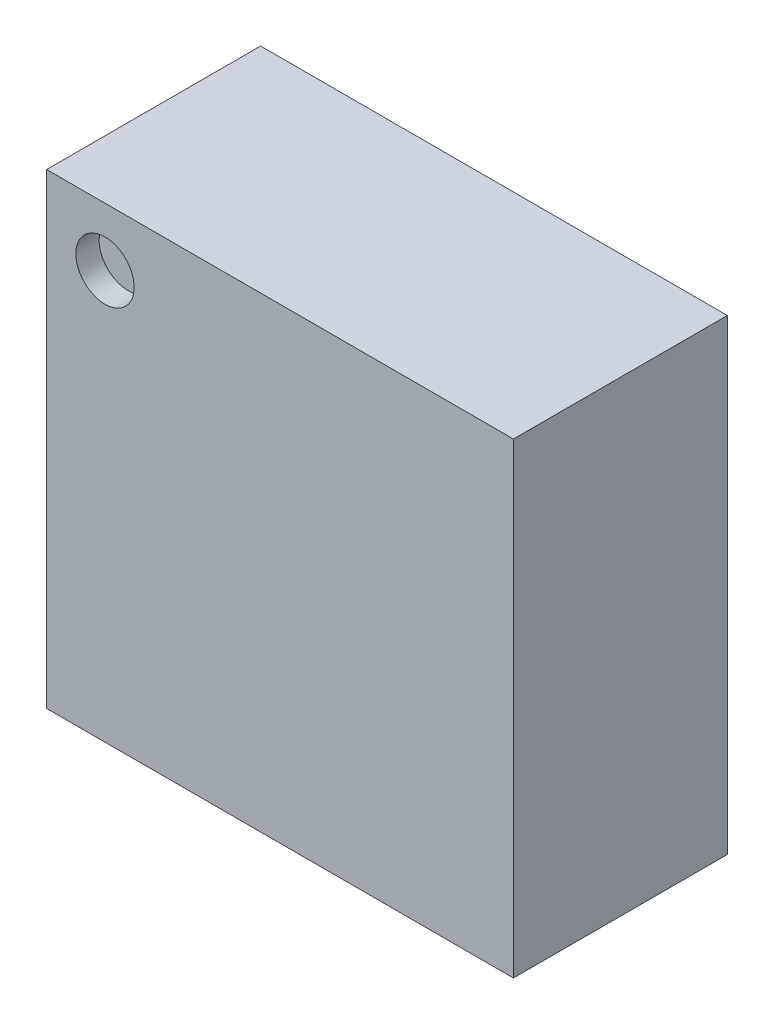
ISO-10303-21;
HEADER;
FILE_DESCRIPTION(('STEP AP214'),'2;1');
FILE_NAME('part.step','',(''),(''),'','','');
FILE_SCHEMA(('AUTOMOTIVE_DESIGN { 1 0 10303 214 1 1 1 1 }'));
ENDSEC;
DATA;
#1=APPLICATION_CONTEXT('core data for automotive mechanical design processes');
#2=APPLICATION_PROTOCOL_DEFINITION('international standard','automotive_design',2000,#1);
#3=PRODUCT_CONTEXT('',#1,'mechanical');
#4=PRODUCT('Part','Part','',(#3));
#5=PRODUCT_RELATED_PRODUCT_CATEGORY('part','',(#4));
#6=PRODUCT_DEFINITION_FORMATION('','',#4);
#7=PRODUCT_DEFINITION_CONTEXT('part definition',#1,'design');
#8=PRODUCT_DEFINITION('design','',#6,#7);
#9=PRODUCT_DEFINITION_SHAPE('','',#8);
#10=(LENGTH_UNIT() NAMED_UNIT(*) SI_UNIT(.MILLI.,.METRE.));
#11=(NAMED_UNIT(*) PLANE_ANGLE_UNIT() SI_UNIT($,.RADIAN.));
#12=(NAMED_UNIT(*) SI_UNIT($,.STERADIAN.) SOLID_ANGLE_UNIT());
#13=UNCERTAINTY_MEASURE_WITH_UNIT(LENGTH_MEASURE(1.E-05),#10,'distance_accuracy_value','');
#14=(GEOMETRIC_REPRESENTATION_CONTEXT(3) GLOBAL_UNCERTAINTY_ASSIGNED_CONTEXT((#13)) GLOBAL_UNIT_ASSIGNED_CONTEXT((#10,
#11,#12)) REPRESENTATION_CONTEXT('',''));
#15=CARTESIAN_POINT('',(0.,0.,0.));
#16=DIRECTION('',(0.,0.,1.));
#17=DIRECTION('',(1.,0.,0.));
#18=AXIS2_PLACEMENT_3D('',#15,#16,#17);
#19=CARTESIAN_POINT('',(-0.45,0.45,0.54));
#20=DIRECTION('',(0.,0.,1.));
#21=DIRECTION('',(1.,0.,0.));
#22=AXIS2_PLACEMENT_3D('',#19,#20,#21);
#23=PLANE('',#22);
#24=CARTESIAN_POINT('',(-0.45,0.45,0.54));
#25=DIRECTION('',(0.,0.,1.));
#26=DIRECTION('',(1.,0.,0.));
#27=AXIS2_PLACEMENT_3D('',#24,#25,#26);
#28=CIRCLE('',#27,0.075);
#29=CARTESIAN_POINT('',(-0.375,0.45,0.54));
#30=VERTEX_POINT('',#29);
#31=EDGE_CURVE('E20',#30,#30,#28,.T.);
#32=ORIENTED_EDGE('',*,*,#31,.T.);
#33=EDGE_LOOP('',(#32));
#34=FACE_BOUND('',#33,.T.);
#35=ADVANCED_FACE('F17',(#34),#23,.T.);
#36=CARTESIAN_POINT('',(-0.45,0.45,0.54));
#37=DIRECTION('',(0.,0.,1.));
#38=DIRECTION('',(1.,0.,0.));
#39=AXIS2_PLACEMENT_3D('',#36,#37,#38);
#40=CYLINDRICAL_SURFACE('',#39,0.075);
#41=CARTESIAN_POINT('',(-0.45,0.45,0.6));
#42=DIRECTION('',(0.,0.,1.));
#43=DIRECTION('',(1.,0.,0.));
#44=AXIS2_PLACEMENT_3D('',#41,#42,#43);
#45=CIRCLE('',#44,0.075);
#46=CARTESIAN_POINT('',(-0.375,0.45,0.6));
#47=VERTEX_POINT('',#46);
#48=EDGE_CURVE('E66',#47,#47,#45,.F.);
#49=ORIENTED_EDGE('',*,*,#48,.F.);
#50=EDGE_LOOP('',(#49));
#51=FACE_BOUND('',#50,.T.);
#52=ORIENTED_EDGE('',*,*,#31,.F.);
#53=EDGE_LOOP('',(#52));
#54=FACE_BOUND('',#53,.T.);
#55=ADVANCED_FACE('F87',(#51,#54),#40,.F.);
#56=CARTESIAN_POINT('',(-0.6,-0.6,0.6));
#57=DIRECTION('',(0.,0.,1.));
#58=DIRECTION('',(1.,0.,0.));
#59=AXIS2_PLACEMENT_3D('',#56,#57,#58);
#60=PLANE('',#59);
#61=ORIENTED_EDGE('',*,*,#48,.T.);
#62=EDGE_LOOP('',(#61));
#63=FACE_BOUND('',#62,.T.);
#64=DIRECTION('',(0.,1.,0.));
#65=VECTOR('',#64,1.);
#66=CARTESIAN_POINT('',(0.6,-0.6,0.6));
#67=LINE('',#66,#65);
#68=CARTESIAN_POINT('',(0.6,0.6,0.6));
#69=VERTEX_POINT('',#68);
#70=CARTESIAN_POINT('',(0.6,-0.6,0.6));
#71=VERTEX_POINT('',#70);
#72=EDGE_CURVE('E166',#69,#71,#67,.F.);
#73=ORIENTED_EDGE('',*,*,#72,.F.);
#74=DIRECTION('',(1.,0.,0.));
#75=VECTOR('',#74,1.);
#76=CARTESIAN_POINT('',(-0.6,0.6,0.6));
#77=LINE('',#76,#75);
#78=CARTESIAN_POINT('',(-0.6,0.6,0.6));
#79=VERTEX_POINT('',#78);
#80=EDGE_CURVE('E60',#79,#69,#77,.T.);
#81=ORIENTED_EDGE('',*,*,#80,.F.);
#82=DIRECTION('',(0.,1.,0.));
#83=VECTOR('',#82,1.);
#84=CARTESIAN_POINT('',(-0.6,-0.6,0.6));
#85=LINE('',#84,#83);
#86=CARTESIAN_POINT('',(-0.6,-0.6,0.6));
#87=VERTEX_POINT('',#86);
#88=EDGE_CURVE('E58',#79,#87,#85,.F.);
#89=ORIENTED_EDGE('',*,*,#88,.T.);
#90=DIRECTION('',(1.,0.,0.));
#91=VECTOR('',#90,1.);
#92=CARTESIAN_POINT('',(-0.6,-0.6,0.6));
#93=LINE('',#92,#91);
#94=EDGE_CURVE('E55',#87,#71,#93,.T.);
#95=ORIENTED_EDGE('',*,*,#94,.T.);
#96=EDGE_LOOP('',(#73,#81,#89,#95));
#97=FACE_BOUND('',#96,.T.);
#98=ADVANCED_FACE('F59',(#63,#97),#60,.T.);
#99=CARTESIAN_POINT('',(-0.6,-0.6,0.05));
#100=DIRECTION('',(1.,0.,0.));
#101=DIRECTION('',(0.,0.,-1.));
#102=AXIS2_PLACEMENT_3D('',#99,#100,#101);
#103=PLANE('',#102);
#104=DIRECTION('',(0.,0.,1.));
#105=VECTOR('',#104,1.);
#106=CARTESIAN_POINT('',(-0.6,0.6,0.05));
#107=LINE('',#106,#105);
#108=CARTESIAN_POINT('',(-0.6,0.6,0.05));
#109=VERTEX_POINT('',#108);
#110=EDGE_CURVE('E170',#109,#79,#107,.T.);
#111=ORIENTED_EDGE('',*,*,#110,.F.);
#112=DIRECTION('',(0.,1.,0.));
#113=VECTOR('',#112,1.);
#114=CARTESIAN_POINT('',(-0.6,-0.6,0.05));
#115=LINE('',#114,#113);
#116=CARTESIAN_POINT('',(-0.6,-0.6,0.05));
#117=VERTEX_POINT('',#116);
#118=EDGE_CURVE('E77',#109,#117,#115,.F.);
#119=ORIENTED_EDGE('',*,*,#118,.T.);
#120=DIRECTION('',(0.,0.,1.));
#121=VECTOR('',#120,1.);
#122=CARTESIAN_POINT('',(-0.6,-0.6,0.05));
#123=LINE('',#122,#121);
#124=EDGE_CURVE('E65',#117,#87,#123,.T.);
#125=ORIENTED_EDGE('',*,*,#124,.T.);
#126=ORIENTED_EDGE('',*,*,#88,.F.);
#127=EDGE_LOOP('',(#111,#119,#125,#126));
#128=FACE_BOUND('',#127,.T.);
#129=ADVANCED_FACE('F76',(#128),#103,.F.);
#130=CARTESIAN_POINT('',(-0.6,-0.6,0.05));
#131=DIRECTION('',(0.,1.,0.));
#132=DIRECTION('',(0.,0.,1.));
#133=AXIS2_PLACEMENT_3D('',#130,#131,#132);
#134=PLANE('',#133);
#135=ORIENTED_EDGE('',*,*,#94,.F.);
#136=ORIENTED_EDGE('',*,*,#124,.F.);
#137=DIRECTION('',(1.,0.,0.));
#138=VECTOR('',#137,1.);
#139=CARTESIAN_POINT('',(-0.6,-0.6,0.05));
#140=LINE('',#139,#138);
#141=CARTESIAN_POINT('',(0.6,-0.6,0.05));
#142=VERTEX_POINT('',#141);
#143=EDGE_CURVE('E168',#117,#142,#140,.T.);
#144=ORIENTED_EDGE('',*,*,#143,.T.);
#145=DIRECTION('',(0.,0.,-1.));
#146=VECTOR('',#145,1.);
#147=CARTESIAN_POINT('',(0.6,-0.6,0.05));
#148=LINE('',#147,#146);
#149=EDGE_CURVE('E73',#71,#142,#148,.T.);
#150=ORIENTED_EDGE('',*,*,#149,.F.);
#151=EDGE_LOOP('',(#135,#136,#144,#150));
#152=FACE_BOUND('',#151,.T.);
#153=ADVANCED_FACE('F70',(#152),#134,.F.);
#154=CARTESIAN_POINT('',(0.6,-0.6,0.05));
#155=DIRECTION('',(1.,0.,0.));
#156=DIRECTION('',(0.,0.,-1.));
#157=AXIS2_PLACEMENT_3D('',#154,#155,#156);
#158=PLANE('',#157);
#159=DIRECTION('',(0.,0.,1.));
#160=VECTOR('',#159,1.);
#161=CARTESIAN_POINT('',(0.6,0.6,0.05));
#162=LINE('',#161,#160);
#163=CARTESIAN_POINT('',(0.6,0.6,0.05));
#164=VERTEX_POINT('',#163);
#165=EDGE_CURVE('E34',#69,#164,#162,.F.);
#166=ORIENTED_EDGE('',*,*,#165,.F.);
#167=ORIENTED_EDGE('',*,*,#72,.T.);
#168=ORIENTED_EDGE('',*,*,#149,.T.);
#169=DIRECTION('',(0.,1.,0.));
#170=VECTOR('',#169,1.);
#171=CARTESIAN_POINT('',(0.6,-0.6,0.05));
#172=LINE('',#171,#170);
#173=EDGE_CURVE('E26',#142,#164,#172,.T.);
#174=ORIENTED_EDGE('',*,*,#173,.T.);
#175=EDGE_LOOP('',(#166,#167,#168,#174));
#176=FACE_BOUND('',#175,.T.);
#177=ADVANCED_FACE('F104',(#176),#158,.T.);
#178=CARTESIAN_POINT('',(-0.6,0.6,0.05));
#179=DIRECTION('',(0.,1.,0.));
#180=DIRECTION('',(0.,0.,1.));
#181=AXIS2_PLACEMENT_3D('',#178,#179,#180);
#182=PLANE('',#181);
#183=ORIENTED_EDGE('',*,*,#80,.T.);
#184=ORIENTED_EDGE('',*,*,#165,.T.);
#185=DIRECTION('',(1.,0.,0.));
#186=VECTOR('',#185,1.);
#187=CARTESIAN_POINT('',(-0.6,0.6,0.05));
#188=LINE('',#187,#186);
#189=EDGE_CURVE('E11',#164,#109,#188,.F.);
#190=ORIENTED_EDGE('',*,*,#189,.T.);
#191=ORIENTED_EDGE('',*,*,#110,.T.);
#192=EDGE_LOOP('',(#183,#184,#190,#191));
#193=FACE_BOUND('',#192,.T.);
#194=ADVANCED_FACE('F98',(#193),#182,.T.);
#195=CARTESIAN_POINT('',(-0.6,-0.6,0.05));
#196=DIRECTION('',(0.,0.,1.));
#197=DIRECTION('',(1.,0.,0.));
#198=AXIS2_PLACEMENT_3D('',#195,#196,#197);
#199=PLANE('',#198);
#200=ORIENTED_EDGE('',*,*,#173,.F.);
#201=ORIENTED_EDGE('',*,*,#143,.F.);
#202=ORIENTED_EDGE('',*,*,#118,.F.);
#203=ORIENTED_EDGE('',*,*,#189,.F.);
#204=EDGE_LOOP('',(#200,#201,#202,#203));
#205=FACE_BOUND('',#204,.T.);
#206=ADVANCED_FACE('F96',(#205),#199,.F.);
#207=CLOSED_SHELL('',(#35,#55,#98,#129,#153,#177,#194,#206));
#208=MANIFOLD_SOLID_BREP('B1',#207);
#209=ADVANCED_BREP_SHAPE_REPRESENTATION('',(#18,#208),#14);
#210=SHAPE_DEFINITION_REPRESENTATION(#9,#209);
ENDSEC;
END-ISO-10303-21;
